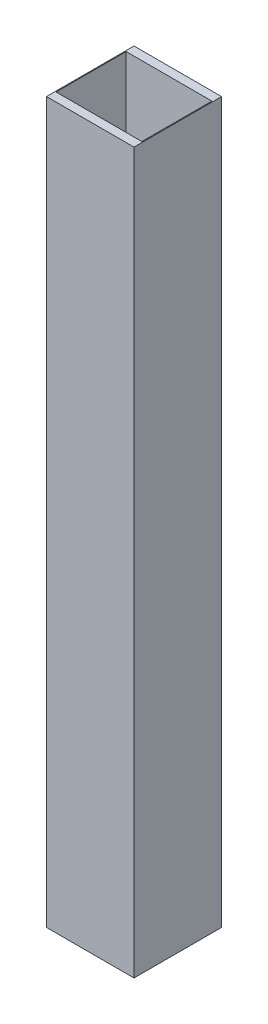
ISO-10303-21;
HEADER;
FILE_DESCRIPTION(('STEP AP214'),'2;1');
FILE_NAME('part.step','',(''),(''),'','','');
FILE_SCHEMA(('AUTOMOTIVE_DESIGN { 1 0 10303 214 1 1 1 1 }'));
ENDSEC;
DATA;
#1=APPLICATION_CONTEXT('core data for automotive mechanical design processes');
#2=APPLICATION_PROTOCOL_DEFINITION('international standard','automotive_design',2000,#1);
#3=PRODUCT_CONTEXT('',#1,'mechanical');
#4=PRODUCT('Part','Part','',(#3));
#5=PRODUCT_RELATED_PRODUCT_CATEGORY('part','',(#4));
#6=PRODUCT_DEFINITION_FORMATION('','',#4);
#7=PRODUCT_DEFINITION_CONTEXT('part definition',#1,'design');
#8=PRODUCT_DEFINITION('design','',#6,#7);
#9=PRODUCT_DEFINITION_SHAPE('','',#8);
#10=(LENGTH_UNIT() NAMED_UNIT(*) SI_UNIT(.MILLI.,.METRE.));
#11=(NAMED_UNIT(*) PLANE_ANGLE_UNIT() SI_UNIT($,.RADIAN.));
#12=(NAMED_UNIT(*) SI_UNIT($,.STERADIAN.) SOLID_ANGLE_UNIT());
#13=UNCERTAINTY_MEASURE_WITH_UNIT(LENGTH_MEASURE(1.E-05),#10,'distance_accuracy_value','');
#14=(GEOMETRIC_REPRESENTATION_CONTEXT(3) GLOBAL_UNCERTAINTY_ASSIGNED_CONTEXT((#13)) GLOBAL_UNIT_ASSIGNED_CONTEXT((#10,
#11,#12)) REPRESENTATION_CONTEXT('',''));
#15=CARTESIAN_POINT('',(0.,0.,0.));
#16=DIRECTION('',(0.,0.,1.));
#17=DIRECTION('',(1.,0.,0.));
#18=AXIS2_PLACEMENT_3D('',#15,#16,#17);
#19=CARTESIAN_POINT('',(0.,41.1,0.));
#20=DIRECTION('',(0.,-1.,0.));
#21=DIRECTION('',(0.,0.,-1.));
#22=AXIS2_PLACEMENT_3D('',#19,#20,#21);
#23=PLANE('',#22);
#24=DIRECTION('',(0.,0.,-1.));
#25=VECTOR('',#24,1.);
#26=CARTESIAN_POINT('',(2.5,41.1,2.5));
#27=LINE('',#26,#25);
#28=CARTESIAN_POINT('',(2.5,41.1,2.5));
#29=VERTEX_POINT('',#28);
#30=CARTESIAN_POINT('',(2.5,41.1,-2.5));
#31=VERTEX_POINT('',#30);
#32=EDGE_CURVE('E192',#29,#31,#27,.T.);
#33=ORIENTED_EDGE('',*,*,#32,.T.);
#34=DIRECTION('',(-1.,0.,0.));
#35=VECTOR('',#34,1.);
#36=CARTESIAN_POINT('',(-2.5,41.1,-2.5));
#37=LINE('',#36,#35);
#38=CARTESIAN_POINT('',(-2.5,41.1,-2.5));
#39=VERTEX_POINT('',#38);
#40=EDGE_CURVE('E195',#31,#39,#37,.T.);
#41=ORIENTED_EDGE('',*,*,#40,.T.);
#42=DIRECTION('',(0.,0.,1.));
#43=VECTOR('',#42,1.);
#44=CARTESIAN_POINT('',(-2.5,41.1,2.5));
#45=LINE('',#44,#43);
#46=CARTESIAN_POINT('',(-2.5,41.1,2.5));
#47=VERTEX_POINT('',#46);
#48=EDGE_CURVE('E198',#39,#47,#45,.T.);
#49=ORIENTED_EDGE('',*,*,#48,.T.);
#50=DIRECTION('',(1.,0.,0.));
#51=VECTOR('',#50,1.);
#52=CARTESIAN_POINT('',(-2.5,41.1,2.5));
#53=LINE('',#52,#51);
#54=EDGE_CURVE('E200',#47,#29,#53,.T.);
#55=ORIENTED_EDGE('',*,*,#54,.T.);
#56=EDGE_LOOP('',(#33,#41,#49,#55));
#57=FACE_BOUND('',#56,.T.);
#58=DIRECTION('',(0.,0.,-1.));
#59=VECTOR('',#58,1.);
#60=CARTESIAN_POINT('',(2.45,41.1,-2.));
#61=LINE('',#60,#59);
#62=CARTESIAN_POINT('',(2.45,41.1,2.));
#63=VERTEX_POINT('',#62);
#64=CARTESIAN_POINT('',(2.45,41.1,-2.));
#65=VERTEX_POINT('',#64);
#66=EDGE_CURVE('E161',#63,#65,#61,.T.);
#67=ORIENTED_EDGE('',*,*,#66,.F.);
#68=DIRECTION('',(1.,0.,0.));
#69=VECTOR('',#68,1.);
#70=CARTESIAN_POINT('',(-2.45,41.1,2.));
#71=LINE('',#70,#69);
#72=CARTESIAN_POINT('',(-2.45,41.1,2.));
#73=VERTEX_POINT('',#72);
#74=EDGE_CURVE('E169',#73,#63,#71,.T.);
#75=ORIENTED_EDGE('',*,*,#74,.F.);
#76=DIRECTION('',(0.,0.,1.));
#77=VECTOR('',#76,1.);
#78=CARTESIAN_POINT('',(-2.45,41.1,-2.));
#79=LINE('',#78,#77);
#80=CARTESIAN_POINT('',(-2.45,41.1,-2.));
#81=VERTEX_POINT('',#80);
#82=EDGE_CURVE('E166',#81,#73,#79,.T.);
#83=ORIENTED_EDGE('',*,*,#82,.F.);
#84=DIRECTION('',(-1.,0.,0.));
#85=VECTOR('',#84,1.);
#86=CARTESIAN_POINT('',(-2.45,41.1,-2.));
#87=LINE('',#86,#85);
#88=EDGE_CURVE('E163',#65,#81,#87,.T.);
#89=ORIENTED_EDGE('',*,*,#88,.F.);
#90=EDGE_LOOP('',(#67,#75,#83,#89));
#91=FACE_BOUND('',#90,.T.);
#92=ADVANCED_FACE('F33',(#57,#91),#23,.F.);
#93=CARTESIAN_POINT('',(0.,0.,0.));
#94=DIRECTION('',(0.,-1.,0.));
#95=DIRECTION('',(0.,0.,-1.));
#96=AXIS2_PLACEMENT_3D('',#93,#94,#95);
#97=PLANE('',#96);
#98=DIRECTION('',(0.,0.,-1.));
#99=VECTOR('',#98,1.);
#100=CARTESIAN_POINT('',(2.5,0.,2.5));
#101=LINE('',#100,#99);
#102=CARTESIAN_POINT('',(2.5,0.,2.5));
#103=VERTEX_POINT('',#102);
#104=CARTESIAN_POINT('',(2.5,0.,-2.5));
#105=VERTEX_POINT('',#104);
#106=EDGE_CURVE('E191',#103,#105,#101,.T.);
#107=ORIENTED_EDGE('',*,*,#106,.F.);
#108=DIRECTION('',(1.,0.,0.));
#109=VECTOR('',#108,1.);
#110=CARTESIAN_POINT('',(-2.5,0.,2.5));
#111=LINE('',#110,#109);
#112=CARTESIAN_POINT('',(-2.5,0.,2.5));
#113=VERTEX_POINT('',#112);
#114=EDGE_CURVE('E196',#113,#103,#111,.T.);
#115=ORIENTED_EDGE('',*,*,#114,.F.);
#116=DIRECTION('',(0.,0.,1.));
#117=VECTOR('',#116,1.);
#118=CARTESIAN_POINT('',(-2.5,0.,2.5));
#119=LINE('',#118,#117);
#120=CARTESIAN_POINT('',(-2.5,0.,-2.5));
#121=VERTEX_POINT('',#120);
#122=EDGE_CURVE('E207',#121,#113,#119,.T.);
#123=ORIENTED_EDGE('',*,*,#122,.F.);
#124=DIRECTION('',(-1.,0.,0.));
#125=VECTOR('',#124,1.);
#126=CARTESIAN_POINT('',(-2.5,0.,-2.5));
#127=LINE('',#126,#125);
#128=EDGE_CURVE('E205',#105,#121,#127,.T.);
#129=ORIENTED_EDGE('',*,*,#128,.F.);
#130=EDGE_LOOP('',(#107,#115,#123,#129));
#131=FACE_BOUND('',#130,.T.);
#132=DIRECTION('',(1.,0.,0.));
#133=VECTOR('',#132,1.);
#134=CARTESIAN_POINT('',(-2.45,0.,2.));
#135=LINE('',#134,#133);
#136=CARTESIAN_POINT('',(-2.45,0.,2.));
#137=VERTEX_POINT('',#136);
#138=CARTESIAN_POINT('',(2.45,0.,2.));
#139=VERTEX_POINT('',#138);
#140=EDGE_CURVE('E164',#137,#139,#135,.T.);
#141=ORIENTED_EDGE('',*,*,#140,.T.);
#142=DIRECTION('',(0.,0.,-1.));
#143=VECTOR('',#142,1.);
#144=CARTESIAN_POINT('',(2.45,0.,-2.));
#145=LINE('',#144,#143);
#146=CARTESIAN_POINT('',(2.45,0.,-2.));
#147=VERTEX_POINT('',#146);
#148=EDGE_CURVE('E160',#139,#147,#145,.T.);
#149=ORIENTED_EDGE('',*,*,#148,.T.);
#150=DIRECTION('',(-1.,0.,0.));
#151=VECTOR('',#150,1.);
#152=CARTESIAN_POINT('',(-2.45,0.,-2.));
#153=LINE('',#152,#151);
#154=CARTESIAN_POINT('',(-2.45,0.,-2.));
#155=VERTEX_POINT('',#154);
#156=EDGE_CURVE('E174',#147,#155,#153,.T.);
#157=ORIENTED_EDGE('',*,*,#156,.T.);
#158=DIRECTION('',(0.,0.,1.));
#159=VECTOR('',#158,1.);
#160=CARTESIAN_POINT('',(-2.45,0.,-2.));
#161=LINE('',#160,#159);
#162=EDGE_CURVE('E177',#155,#137,#161,.T.);
#163=ORIENTED_EDGE('',*,*,#162,.T.);
#164=EDGE_LOOP('',(#141,#149,#157,#163));
#165=FACE_BOUND('',#164,.T.);
#166=ADVANCED_FACE('F225',(#131,#165),#97,.T.);
#167=CARTESIAN_POINT('',(2.5,41.1,2.5));
#168=DIRECTION('',(-1.,0.,0.));
#169=DIRECTION('',(0.,0.,1.));
#170=AXIS2_PLACEMENT_3D('',#167,#168,#169);
#171=PLANE('',#170);
#172=ORIENTED_EDGE('',*,*,#106,.T.);
#173=DIRECTION('',(0.,-1.,0.));
#174=VECTOR('',#173,1.);
#175=CARTESIAN_POINT('',(2.5,41.1,-2.5));
#176=LINE('',#175,#174);
#177=EDGE_CURVE('E11',#31,#105,#176,.T.);
#178=ORIENTED_EDGE('',*,*,#177,.F.);
#179=ORIENTED_EDGE('',*,*,#32,.F.);
#180=DIRECTION('',(0.,-1.,0.));
#181=VECTOR('',#180,1.);
#182=CARTESIAN_POINT('',(2.5,41.1,2.5));
#183=LINE('',#182,#181);
#184=EDGE_CURVE('E202',#29,#103,#183,.T.);
#185=ORIENTED_EDGE('',*,*,#184,.T.);
#186=EDGE_LOOP('',(#172,#178,#179,#185));
#187=FACE_BOUND('',#186,.T.);
#188=ADVANCED_FACE('F35',(#187),#171,.F.);
#189=CARTESIAN_POINT('',(-2.5,41.1,-2.5));
#190=DIRECTION('',(0.,0.,1.));
#191=DIRECTION('',(1.,0.,0.));
#192=AXIS2_PLACEMENT_3D('',#189,#190,#191);
#193=PLANE('',#192);
#194=ORIENTED_EDGE('',*,*,#128,.T.);
#195=DIRECTION('',(0.,-1.,0.));
#196=VECTOR('',#195,1.);
#197=CARTESIAN_POINT('',(-2.5,41.1,-2.5));
#198=LINE('',#197,#196);
#199=EDGE_CURVE('E41',#39,#121,#198,.T.);
#200=ORIENTED_EDGE('',*,*,#199,.F.);
#201=ORIENTED_EDGE('',*,*,#40,.F.);
#202=ORIENTED_EDGE('',*,*,#177,.T.);
#203=EDGE_LOOP('',(#194,#200,#201,#202));
#204=FACE_BOUND('',#203,.T.);
#205=ADVANCED_FACE('F236',(#204),#193,.F.);
#206=CARTESIAN_POINT('',(-2.5,41.1,2.5));
#207=DIRECTION('',(1.,0.,0.));
#208=DIRECTION('',(0.,0.,-1.));
#209=AXIS2_PLACEMENT_3D('',#206,#207,#208);
#210=PLANE('',#209);
#211=DIRECTION('',(0.,1.,0.));
#212=VECTOR('',#211,1.);
#213=CARTESIAN_POINT('',(-2.5,41.1,-1.25));
#214=LINE('',#213,#212);
#215=CARTESIAN_POINT('',(-2.5,1.,-1.25));
#216=VERTEX_POINT('',#215);
#217=CARTESIAN_POINT('',(-2.5,3.5,-1.25));
#218=VERTEX_POINT('',#217);
#219=EDGE_CURVE('E157',#216,#218,#214,.T.);
#220=ORIENTED_EDGE('',*,*,#219,.T.);
#221=DIRECTION('',(0.,0.,1.));
#222=VECTOR('',#221,1.);
#223=CARTESIAN_POINT('',(-2.5,3.5,2.5));
#224=LINE('',#223,#222);
#225=CARTESIAN_POINT('',(-2.5,3.5,1.25));
#226=VERTEX_POINT('',#225);
#227=EDGE_CURVE('E138',#218,#226,#224,.T.);
#228=ORIENTED_EDGE('',*,*,#227,.T.);
#229=DIRECTION('',(0.,-1.,0.));
#230=VECTOR('',#229,1.);
#231=CARTESIAN_POINT('',(-2.5,41.1,1.25));
#232=LINE('',#231,#230);
#233=CARTESIAN_POINT('',(-2.5,1.,1.25));
#234=VERTEX_POINT('',#233);
#235=EDGE_CURVE('E151',#226,#234,#232,.T.);
#236=ORIENTED_EDGE('',*,*,#235,.T.);
#237=DIRECTION('',(0.,0.,-1.));
#238=VECTOR('',#237,1.);
#239=CARTESIAN_POINT('',(-2.5,1.,2.5));
#240=LINE('',#239,#238);
#241=EDGE_CURVE('E154',#234,#216,#240,.T.);
#242=ORIENTED_EDGE('',*,*,#241,.T.);
#243=EDGE_LOOP('',(#220,#228,#236,#242));
#244=FACE_BOUND('',#243,.T.);
#245=ORIENTED_EDGE('',*,*,#122,.T.);
#246=DIRECTION('',(0.,-1.,0.));
#247=VECTOR('',#246,1.);
#248=CARTESIAN_POINT('',(-2.5,41.1,2.5));
#249=LINE('',#248,#247);
#250=EDGE_CURVE('E212',#47,#113,#249,.T.);
#251=ORIENTED_EDGE('',*,*,#250,.F.);
#252=ORIENTED_EDGE('',*,*,#48,.F.);
#253=ORIENTED_EDGE('',*,*,#199,.T.);
#254=EDGE_LOOP('',(#245,#251,#252,#253));
#255=FACE_BOUND('',#254,.T.);
#256=ADVANCED_FACE('F219',(#244,#255),#210,.F.);
#257=CARTESIAN_POINT('',(-2.5,41.1,2.5));
#258=DIRECTION('',(0.,0.,-1.));
#259=DIRECTION('',(-1.,0.,0.));
#260=AXIS2_PLACEMENT_3D('',#257,#258,#259);
#261=PLANE('',#260);
#262=ORIENTED_EDGE('',*,*,#114,.T.);
#263=ORIENTED_EDGE('',*,*,#184,.F.);
#264=ORIENTED_EDGE('',*,*,#54,.F.);
#265=ORIENTED_EDGE('',*,*,#250,.T.);
#266=EDGE_LOOP('',(#262,#263,#264,#265));
#267=FACE_BOUND('',#266,.T.);
#268=ADVANCED_FACE('F229',(#267),#261,.F.);
#269=CARTESIAN_POINT('',(2.45,41.1,-2.));
#270=DIRECTION('',(-1.,0.,0.));
#271=DIRECTION('',(0.,0.,1.));
#272=AXIS2_PLACEMENT_3D('',#269,#270,#271);
#273=PLANE('',#272);
#274=ORIENTED_EDGE('',*,*,#148,.F.);
#275=DIRECTION('',(0.,-1.,0.));
#276=VECTOR('',#275,1.);
#277=CARTESIAN_POINT('',(2.45,41.1,2.));
#278=LINE('',#277,#276);
#279=EDGE_CURVE('E171',#63,#139,#278,.T.);
#280=ORIENTED_EDGE('',*,*,#279,.F.);
#281=ORIENTED_EDGE('',*,*,#66,.T.);
#282=DIRECTION('',(0.,-1.,0.));
#283=VECTOR('',#282,1.);
#284=CARTESIAN_POINT('',(2.45,41.1,-2.));
#285=LINE('',#284,#283);
#286=EDGE_CURVE('E188',#65,#147,#285,.T.);
#287=ORIENTED_EDGE('',*,*,#286,.T.);
#288=EDGE_LOOP('',(#274,#280,#281,#287));
#289=FACE_BOUND('',#288,.T.);
#290=ADVANCED_FACE('F251',(#289),#273,.T.);
#291=CARTESIAN_POINT('',(-2.45,41.1,-2.));
#292=DIRECTION('',(0.,0.,1.));
#293=DIRECTION('',(1.,0.,0.));
#294=AXIS2_PLACEMENT_3D('',#291,#292,#293);
#295=PLANE('',#294);
#296=ORIENTED_EDGE('',*,*,#156,.F.);
#297=ORIENTED_EDGE('',*,*,#286,.F.);
#298=ORIENTED_EDGE('',*,*,#88,.T.);
#299=DIRECTION('',(0.,-1.,0.));
#300=VECTOR('',#299,1.);
#301=CARTESIAN_POINT('',(-2.45,41.1,-2.));
#302=LINE('',#301,#300);
#303=EDGE_CURVE('E186',#81,#155,#302,.T.);
#304=ORIENTED_EDGE('',*,*,#303,.T.);
#305=EDGE_LOOP('',(#296,#297,#298,#304));
#306=FACE_BOUND('',#305,.T.);
#307=ADVANCED_FACE('F258',(#306),#295,.T.);
#308=CARTESIAN_POINT('',(-2.45,41.1,-2.));
#309=DIRECTION('',(1.,0.,0.));
#310=DIRECTION('',(0.,0.,-1.));
#311=AXIS2_PLACEMENT_3D('',#308,#309,#310);
#312=PLANE('',#311);
#313=DIRECTION('',(0.,0.,-1.));
#314=VECTOR('',#313,1.);
#315=CARTESIAN_POINT('',(-2.45,3.5,-1.25));
#316=LINE('',#315,#314);
#317=CARTESIAN_POINT('',(-2.45,3.5,1.25));
#318=VERTEX_POINT('',#317);
#319=CARTESIAN_POINT('',(-2.45,3.5,-1.25));
#320=VERTEX_POINT('',#319);
#321=EDGE_CURVE('E135',#318,#320,#316,.T.);
#322=ORIENTED_EDGE('',*,*,#321,.T.);
#323=DIRECTION('',(0.,-1.,0.));
#324=VECTOR('',#323,1.);
#325=CARTESIAN_POINT('',(-2.45,1.,-1.25));
#326=LINE('',#325,#324);
#327=CARTESIAN_POINT('',(-2.45,1.,-1.25));
#328=VERTEX_POINT('',#327);
#329=EDGE_CURVE('E122',#320,#328,#326,.T.);
#330=ORIENTED_EDGE('',*,*,#329,.T.);
#331=DIRECTION('',(0.,0.,1.));
#332=VECTOR('',#331,1.);
#333=CARTESIAN_POINT('',(-2.45,1.,-1.25));
#334=LINE('',#333,#332);
#335=CARTESIAN_POINT('',(-2.45,1.,1.25));
#336=VERTEX_POINT('',#335);
#337=EDGE_CURVE('E146',#328,#336,#334,.T.);
#338=ORIENTED_EDGE('',*,*,#337,.T.);
#339=DIRECTION('',(0.,1.,0.));
#340=VECTOR('',#339,1.);
#341=CARTESIAN_POINT('',(-2.45,1.,1.25));
#342=LINE('',#341,#340);
#343=EDGE_CURVE('E142',#336,#318,#342,.T.);
#344=ORIENTED_EDGE('',*,*,#343,.T.);
#345=EDGE_LOOP('',(#322,#330,#338,#344));
#346=FACE_BOUND('',#345,.T.);
#347=ORIENTED_EDGE('',*,*,#162,.F.);
#348=ORIENTED_EDGE('',*,*,#303,.F.);
#349=ORIENTED_EDGE('',*,*,#82,.T.);
#350=DIRECTION('',(0.,-1.,0.));
#351=VECTOR('',#350,1.);
#352=CARTESIAN_POINT('',(-2.45,41.1,2.));
#353=LINE('',#352,#351);
#354=EDGE_CURVE('E184',#73,#137,#353,.T.);
#355=ORIENTED_EDGE('',*,*,#354,.T.);
#356=EDGE_LOOP('',(#347,#348,#349,#355));
#357=FACE_BOUND('',#356,.T.);
#358=ADVANCED_FACE('F140',(#346,#357),#312,.T.);
#359=CARTESIAN_POINT('',(-2.45,41.1,2.));
#360=DIRECTION('',(0.,0.,-1.));
#361=DIRECTION('',(-1.,0.,0.));
#362=AXIS2_PLACEMENT_3D('',#359,#360,#361);
#363=PLANE('',#362);
#364=ORIENTED_EDGE('',*,*,#140,.F.);
#365=ORIENTED_EDGE('',*,*,#354,.F.);
#366=ORIENTED_EDGE('',*,*,#74,.T.);
#367=ORIENTED_EDGE('',*,*,#279,.T.);
#368=EDGE_LOOP('',(#364,#365,#366,#367));
#369=FACE_BOUND('',#368,.T.);
#370=ADVANCED_FACE('F269',(#369),#363,.T.);
#371=CARTESIAN_POINT('',(1.08553390593274,3.5,-1.25));
#372=DIRECTION('',(0.,1.,0.));
#373=DIRECTION('',(0.,0.,1.));
#374=AXIS2_PLACEMENT_3D('',#371,#372,#373);
#375=PLANE('',#374);
#376=DIRECTION('',(-1.,0.,0.));
#377=VECTOR('',#376,1.);
#378=CARTESIAN_POINT('',(1.08553390593274,3.5,-1.25));
#379=LINE('',#378,#377);
#380=EDGE_CURVE('E125',#320,#218,#379,.T.);
#381=ORIENTED_EDGE('',*,*,#380,.F.);
#382=ORIENTED_EDGE('',*,*,#321,.F.);
#383=DIRECTION('',(-1.,0.,0.));
#384=VECTOR('',#383,1.);
#385=CARTESIAN_POINT('',(1.08553390593274,3.5,1.25));
#386=LINE('',#385,#384);
#387=EDGE_CURVE('E53',#318,#226,#386,.T.);
#388=ORIENTED_EDGE('',*,*,#387,.T.);
#389=ORIENTED_EDGE('',*,*,#227,.F.);
#390=EDGE_LOOP('',(#381,#382,#388,#389));
#391=FACE_BOUND('',#390,.T.);
#392=ADVANCED_FACE('F134',(#391),#375,.F.);
#393=CARTESIAN_POINT('',(1.08553390593274,1.,-1.25));
#394=DIRECTION('',(0.,0.,-1.));
#395=DIRECTION('',(-1.,0.,0.));
#396=AXIS2_PLACEMENT_3D('',#393,#394,#395);
#397=PLANE('',#396);
#398=DIRECTION('',(-1.,0.,0.));
#399=VECTOR('',#398,1.);
#400=CARTESIAN_POINT('',(1.08553390593274,1.,-1.25));
#401=LINE('',#400,#399);
#402=EDGE_CURVE('E128',#328,#216,#401,.T.);
#403=ORIENTED_EDGE('',*,*,#402,.F.);
#404=ORIENTED_EDGE('',*,*,#329,.F.);
#405=ORIENTED_EDGE('',*,*,#380,.T.);
#406=ORIENTED_EDGE('',*,*,#219,.F.);
#407=EDGE_LOOP('',(#403,#404,#405,#406));
#408=FACE_BOUND('',#407,.T.);
#409=ADVANCED_FACE('F124',(#408),#397,.F.);
#410=CARTESIAN_POINT('',(1.08553390593274,1.,-1.25));
#411=DIRECTION('',(0.,-1.,0.));
#412=DIRECTION('',(0.,0.,-1.));
#413=AXIS2_PLACEMENT_3D('',#410,#411,#412);
#414=PLANE('',#413);
#415=DIRECTION('',(-1.,0.,0.));
#416=VECTOR('',#415,1.);
#417=CARTESIAN_POINT('',(1.08553390593274,1.,1.25));
#418=LINE('',#417,#416);
#419=EDGE_CURVE('E48',#336,#234,#418,.T.);
#420=ORIENTED_EDGE('',*,*,#419,.F.);
#421=ORIENTED_EDGE('',*,*,#337,.F.);
#422=ORIENTED_EDGE('',*,*,#402,.T.);
#423=ORIENTED_EDGE('',*,*,#241,.F.);
#424=EDGE_LOOP('',(#420,#421,#422,#423));
#425=FACE_BOUND('',#424,.T.);
#426=ADVANCED_FACE('F286',(#425),#414,.F.);
#427=CARTESIAN_POINT('',(1.08553390593274,1.,1.25));
#428=DIRECTION('',(0.,0.,1.));
#429=DIRECTION('',(1.,0.,0.));
#430=AXIS2_PLACEMENT_3D('',#427,#428,#429);
#431=PLANE('',#430);
#432=ORIENTED_EDGE('',*,*,#387,.F.);
#433=ORIENTED_EDGE('',*,*,#343,.F.);
#434=ORIENTED_EDGE('',*,*,#419,.T.);
#435=ORIENTED_EDGE('',*,*,#235,.F.);
#436=EDGE_LOOP('',(#432,#433,#434,#435));
#437=FACE_BOUND('',#436,.T.);
#438=ADVANCED_FACE('F289',(#437),#431,.F.);
#439=CLOSED_SHELL('',(#92,#166,#188,#205,#256,#268,#290,#307,#358,#370,#392,#409,#426,#438));
#440=MANIFOLD_SOLID_BREP('B2',#439);
#441=ADVANCED_BREP_SHAPE_REPRESENTATION('',(#18,#440),#14);
#442=SHAPE_DEFINITION_REPRESENTATION(#9,#441);
ENDSEC;
END-ISO-10303-21;
